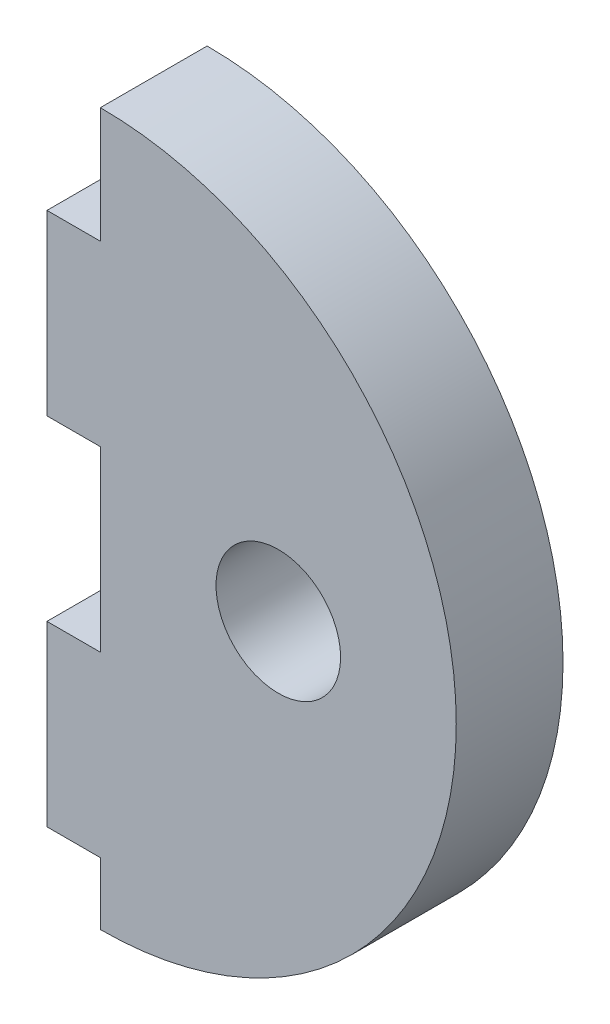
ISO-10303-21;
HEADER;
FILE_DESCRIPTION(('STEP AP214'),'2;1');
FILE_NAME('part.step','',(''),(''),'','','');
FILE_SCHEMA(('AUTOMOTIVE_DESIGN { 1 0 10303 214 1 1 1 1 }'));
ENDSEC;
DATA;
#1=APPLICATION_CONTEXT('core data for automotive mechanical design processes');
#2=APPLICATION_PROTOCOL_DEFINITION('international standard','automotive_design',2000,#1);
#3=PRODUCT_CONTEXT('',#1,'mechanical');
#4=PRODUCT('Part','Part','',(#3));
#5=PRODUCT_RELATED_PRODUCT_CATEGORY('part','',(#4));
#6=PRODUCT_DEFINITION_FORMATION('','',#4);
#7=PRODUCT_DEFINITION_CONTEXT('part definition',#1,'design');
#8=PRODUCT_DEFINITION('design','',#6,#7);
#9=PRODUCT_DEFINITION_SHAPE('','',#8);
#10=(LENGTH_UNIT() NAMED_UNIT(*) SI_UNIT(.MILLI.,.METRE.));
#11=(NAMED_UNIT(*) PLANE_ANGLE_UNIT() SI_UNIT($,.RADIAN.));
#12=(NAMED_UNIT(*) SI_UNIT($,.STERADIAN.) SOLID_ANGLE_UNIT());
#13=UNCERTAINTY_MEASURE_WITH_UNIT(LENGTH_MEASURE(1.E-05),#10,'distance_accuracy_value','');
#14=(GEOMETRIC_REPRESENTATION_CONTEXT(3) GLOBAL_UNCERTAINTY_ASSIGNED_CONTEXT((#13)) GLOBAL_UNIT_ASSIGNED_CONTEXT((#10,
#11,#12)) REPRESENTATION_CONTEXT('',''));
#15=CARTESIAN_POINT('',(0.,0.,0.));
#16=DIRECTION('',(0.,0.,1.));
#17=DIRECTION('',(1.,0.,0.));
#18=AXIS2_PLACEMENT_3D('',#15,#16,#17);
#19=CARTESIAN_POINT('',(3.,16.5,6.));
#20=DIRECTION('',(0.,0.,-1.));
#21=DIRECTION('',(-1.,0.,0.));
#22=AXIS2_PLACEMENT_3D('',#19,#20,#21);
#23=PLANE('',#22);
#24=DIRECTION('',(1.,0.,0.));
#25=VECTOR('',#24,1.);
#26=CARTESIAN_POINT('',(0.,0.,6.));
#27=LINE('',#26,#25);
#28=CARTESIAN_POINT('',(0.,0.,6.));
#29=VERTEX_POINT('',#28);
#30=CARTESIAN_POINT('',(3.,0.,6.));
#31=VERTEX_POINT('',#30);
#32=EDGE_CURVE('E161',#29,#31,#27,.T.);
#33=ORIENTED_EDGE('',*,*,#32,.T.);
#34=DIRECTION('',(0.,-1.,0.));
#35=VECTOR('',#34,1.);
#36=CARTESIAN_POINT('',(3.,0.,6.));
#37=LINE('',#36,#35);
#38=CARTESIAN_POINT('',(3.,-3.5,6.));
#39=VERTEX_POINT('',#38);
#40=EDGE_CURVE('E99',#31,#39,#37,.T.);
#41=ORIENTED_EDGE('',*,*,#40,.T.);
#42=CARTESIAN_POINT('',(3.,16.5,6.));
#43=DIRECTION('',(0.,0.,1.));
#44=DIRECTION('',(-1.,0.,0.));
#45=AXIS2_PLACEMENT_3D('',#42,#43,#44);
#46=CIRCLE('',#45,20.);
#47=CARTESIAN_POINT('',(3.,36.5,6.));
#48=VERTEX_POINT('',#47);
#49=EDGE_CURVE('E182',#39,#48,#46,.T.);
#50=ORIENTED_EDGE('',*,*,#49,.T.);
#51=DIRECTION('',(0.,-1.,0.));
#52=VECTOR('',#51,1.);
#53=CARTESIAN_POINT('',(3.,30.,6.));
#54=LINE('',#53,#52);
#55=CARTESIAN_POINT('',(3.,30.,6.));
#56=VERTEX_POINT('',#55);
#57=EDGE_CURVE('E201',#48,#56,#54,.T.);
#58=ORIENTED_EDGE('',*,*,#57,.T.);
#59=DIRECTION('',(-1.,0.,0.));
#60=VECTOR('',#59,1.);
#61=CARTESIAN_POINT('',(0.,30.,6.));
#62=LINE('',#61,#60);
#63=CARTESIAN_POINT('',(0.,30.,6.));
#64=VERTEX_POINT('',#63);
#65=EDGE_CURVE('E198',#56,#64,#62,.T.);
#66=ORIENTED_EDGE('',*,*,#65,.T.);
#67=DIRECTION('',(0.,-1.,0.));
#68=VECTOR('',#67,1.);
#69=CARTESIAN_POINT('',(0.,20.,6.));
#70=LINE('',#69,#68);
#71=CARTESIAN_POINT('',(0.,20.,6.));
#72=VERTEX_POINT('',#71);
#73=EDGE_CURVE('E200',#64,#72,#70,.T.);
#74=ORIENTED_EDGE('',*,*,#73,.T.);
#75=DIRECTION('',(1.,0.,0.));
#76=VECTOR('',#75,1.);
#77=CARTESIAN_POINT('',(3.,20.,6.));
#78=LINE('',#77,#76);
#79=CARTESIAN_POINT('',(3.,20.,6.));
#80=VERTEX_POINT('',#79);
#81=EDGE_CURVE('E124',#72,#80,#78,.T.);
#82=ORIENTED_EDGE('',*,*,#81,.T.);
#83=DIRECTION('',(0.,-1.,0.));
#84=VECTOR('',#83,1.);
#85=CARTESIAN_POINT('',(3.,10.,6.));
#86=LINE('',#85,#84);
#87=CARTESIAN_POINT('',(3.,10.,6.));
#88=VERTEX_POINT('',#87);
#89=EDGE_CURVE('E118',#80,#88,#86,.T.);
#90=ORIENTED_EDGE('',*,*,#89,.T.);
#91=DIRECTION('',(-1.,0.,0.));
#92=VECTOR('',#91,1.);
#93=CARTESIAN_POINT('',(0.,10.,6.));
#94=LINE('',#93,#92);
#95=CARTESIAN_POINT('',(0.,10.,6.));
#96=VERTEX_POINT('',#95);
#97=EDGE_CURVE('E122',#88,#96,#94,.T.);
#98=ORIENTED_EDGE('',*,*,#97,.T.);
#99=DIRECTION('',(0.,-1.,0.));
#100=VECTOR('',#99,1.);
#101=CARTESIAN_POINT('',(0.,0.,6.));
#102=LINE('',#101,#100);
#103=EDGE_CURVE('E50',#96,#29,#102,.T.);
#104=ORIENTED_EDGE('',*,*,#103,.T.);
#105=EDGE_LOOP('',(#33,#41,#50,#58,#66,#74,#82,#90,#98,#104));
#106=FACE_BOUND('',#105,.T.);
#107=CARTESIAN_POINT('',(13.,16.5,6.));
#108=DIRECTION('',(0.,0.,1.));
#109=DIRECTION('',(1.,0.,0.));
#110=AXIS2_PLACEMENT_3D('',#107,#108,#109);
#111=CIRCLE('',#110,3.5);
#112=CARTESIAN_POINT('',(16.5,16.5,6.));
#113=VERTEX_POINT('',#112);
#114=EDGE_CURVE('E146',#113,#113,#111,.T.);
#115=ORIENTED_EDGE('',*,*,#114,.F.);
#116=EDGE_LOOP('',(#115));
#117=FACE_BOUND('',#116,.T.);
#118=ADVANCED_FACE('F33',(#106,#117),#23,.F.);
#119=CARTESIAN_POINT('',(3.,16.5,0.));
#120=DIRECTION('',(0.,0.,-1.));
#121=DIRECTION('',(-1.,0.,0.));
#122=AXIS2_PLACEMENT_3D('',#119,#120,#121);
#123=PLANE('',#122);
#124=DIRECTION('',(1.,0.,0.));
#125=VECTOR('',#124,1.);
#126=CARTESIAN_POINT('',(0.,0.,0.));
#127=LINE('',#126,#125);
#128=CARTESIAN_POINT('',(0.,0.,0.));
#129=VERTEX_POINT('',#128);
#130=CARTESIAN_POINT('',(3.,0.,0.));
#131=VERTEX_POINT('',#130);
#132=EDGE_CURVE('E142',#129,#131,#127,.T.);
#133=ORIENTED_EDGE('',*,*,#132,.F.);
#134=DIRECTION('',(0.,-1.,0.));
#135=VECTOR('',#134,1.);
#136=CARTESIAN_POINT('',(0.,0.,0.));
#137=LINE('',#136,#135);
#138=CARTESIAN_POINT('',(0.,10.,0.));
#139=VERTEX_POINT('',#138);
#140=EDGE_CURVE('E91',#139,#129,#137,.T.);
#141=ORIENTED_EDGE('',*,*,#140,.F.);
#142=DIRECTION('',(-1.,0.,0.));
#143=VECTOR('',#142,1.);
#144=CARTESIAN_POINT('',(0.,10.,0.));
#145=LINE('',#144,#143);
#146=CARTESIAN_POINT('',(3.,10.,0.));
#147=VERTEX_POINT('',#146);
#148=EDGE_CURVE('E85',#147,#139,#145,.T.);
#149=ORIENTED_EDGE('',*,*,#148,.F.);
#150=DIRECTION('',(0.,-1.,0.));
#151=VECTOR('',#150,1.);
#152=CARTESIAN_POINT('',(3.,10.,0.));
#153=LINE('',#152,#151);
#154=CARTESIAN_POINT('',(3.,20.,0.));
#155=VERTEX_POINT('',#154);
#156=EDGE_CURVE('E132',#155,#147,#153,.T.);
#157=ORIENTED_EDGE('',*,*,#156,.F.);
#158=DIRECTION('',(1.,0.,0.));
#159=VECTOR('',#158,1.);
#160=CARTESIAN_POINT('',(3.,20.,0.));
#161=LINE('',#160,#159);
#162=CARTESIAN_POINT('',(0.,20.,0.));
#163=VERTEX_POINT('',#162);
#164=EDGE_CURVE('E156',#163,#155,#161,.T.);
#165=ORIENTED_EDGE('',*,*,#164,.F.);
#166=DIRECTION('',(0.,-1.,0.));
#167=VECTOR('',#166,1.);
#168=CARTESIAN_POINT('',(0.,20.,0.));
#169=LINE('',#168,#167);
#170=CARTESIAN_POINT('',(0.,30.,0.));
#171=VERTEX_POINT('',#170);
#172=EDGE_CURVE('E154',#171,#163,#169,.T.);
#173=ORIENTED_EDGE('',*,*,#172,.F.);
#174=DIRECTION('',(-1.,0.,0.));
#175=VECTOR('',#174,1.);
#176=CARTESIAN_POINT('',(0.,30.,0.));
#177=LINE('',#176,#175);
#178=CARTESIAN_POINT('',(3.,30.,0.));
#179=VERTEX_POINT('',#178);
#180=EDGE_CURVE('E152',#179,#171,#177,.T.);
#181=ORIENTED_EDGE('',*,*,#180,.F.);
#182=DIRECTION('',(0.,-1.,0.));
#183=VECTOR('',#182,1.);
#184=CARTESIAN_POINT('',(3.,30.,0.));
#185=LINE('',#184,#183);
#186=CARTESIAN_POINT('',(3.,36.5,0.));
#187=VERTEX_POINT('',#186);
#188=EDGE_CURVE('E150',#187,#179,#185,.T.);
#189=ORIENTED_EDGE('',*,*,#188,.F.);
#190=CARTESIAN_POINT('',(3.,16.5,0.));
#191=DIRECTION('',(0.,0.,1.));
#192=DIRECTION('',(-1.,0.,0.));
#193=AXIS2_PLACEMENT_3D('',#190,#191,#192);
#194=CIRCLE('',#193,20.);
#195=CARTESIAN_POINT('',(3.,-3.5,0.));
#196=VERTEX_POINT('',#195);
#197=EDGE_CURVE('E148',#196,#187,#194,.T.);
#198=ORIENTED_EDGE('',*,*,#197,.F.);
#199=DIRECTION('',(0.,-1.,0.));
#200=VECTOR('',#199,1.);
#201=CARTESIAN_POINT('',(3.,0.,0.));
#202=LINE('',#201,#200);
#203=EDGE_CURVE('E145',#131,#196,#202,.T.);
#204=ORIENTED_EDGE('',*,*,#203,.F.);
#205=EDGE_LOOP('',(#133,#141,#149,#157,#165,#173,#181,#189,#198,#204));
#206=FACE_BOUND('',#205,.T.);
#207=CARTESIAN_POINT('',(13.,16.5,0.));
#208=DIRECTION('',(0.,0.,1.));
#209=DIRECTION('',(1.,0.,0.));
#210=AXIS2_PLACEMENT_3D('',#207,#208,#209);
#211=CIRCLE('',#210,3.5);
#212=CARTESIAN_POINT('',(16.5,16.5,0.));
#213=VERTEX_POINT('',#212);
#214=EDGE_CURVE('E209',#213,#213,#211,.T.);
#215=ORIENTED_EDGE('',*,*,#214,.T.);
#216=EDGE_LOOP('',(#215));
#217=FACE_BOUND('',#216,.T.);
#218=ADVANCED_FACE('F186',(#206,#217),#123,.T.);
#219=CARTESIAN_POINT('',(0.,0.,6.));
#220=DIRECTION('',(0.,1.,0.));
#221=DIRECTION('',(0.,0.,1.));
#222=AXIS2_PLACEMENT_3D('',#219,#220,#221);
#223=PLANE('',#222);
#224=ORIENTED_EDGE('',*,*,#132,.T.);
#225=DIRECTION('',(0.,0.,-1.));
#226=VECTOR('',#225,1.);
#227=CARTESIAN_POINT('',(3.,0.,6.));
#228=LINE('',#227,#226);
#229=EDGE_CURVE('E11',#31,#131,#228,.T.);
#230=ORIENTED_EDGE('',*,*,#229,.F.);
#231=ORIENTED_EDGE('',*,*,#32,.F.);
#232=DIRECTION('',(0.,0.,-1.));
#233=VECTOR('',#232,1.);
#234=CARTESIAN_POINT('',(0.,0.,6.));
#235=LINE('',#234,#233);
#236=EDGE_CURVE('E138',#29,#129,#235,.T.);
#237=ORIENTED_EDGE('',*,*,#236,.T.);
#238=EDGE_LOOP('',(#224,#230,#231,#237));
#239=FACE_BOUND('',#238,.T.);
#240=ADVANCED_FACE('F35',(#239),#223,.F.);
#241=CARTESIAN_POINT('',(3.,0.,6.));
#242=DIRECTION('',(1.,0.,0.));
#243=DIRECTION('',(0.,1.,0.));
#244=AXIS2_PLACEMENT_3D('',#241,#242,#243);
#245=PLANE('',#244);
#246=ORIENTED_EDGE('',*,*,#203,.T.);
#247=DIRECTION('',(0.,0.,-1.));
#248=VECTOR('',#247,1.);
#249=CARTESIAN_POINT('',(3.,-3.5,6.));
#250=LINE('',#249,#248);
#251=EDGE_CURVE('E42',#39,#196,#250,.T.);
#252=ORIENTED_EDGE('',*,*,#251,.F.);
#253=ORIENTED_EDGE('',*,*,#40,.F.);
#254=ORIENTED_EDGE('',*,*,#229,.T.);
#255=EDGE_LOOP('',(#246,#252,#253,#254));
#256=FACE_BOUND('',#255,.T.);
#257=ADVANCED_FACE('F245',(#256),#245,.F.);
#258=CARTESIAN_POINT('',(3.,16.5,6.));
#259=DIRECTION('',(0.,0.,-1.));
#260=DIRECTION('',(-1.,0.,0.));
#261=AXIS2_PLACEMENT_3D('',#258,#259,#260);
#262=CYLINDRICAL_SURFACE('',#261,20.);
#263=ORIENTED_EDGE('',*,*,#197,.T.);
#264=DIRECTION('',(0.,0.,-1.));
#265=VECTOR('',#264,1.);
#266=CARTESIAN_POINT('',(3.,36.5,6.));
#267=LINE('',#266,#265);
#268=EDGE_CURVE('E174',#48,#187,#267,.T.);
#269=ORIENTED_EDGE('',*,*,#268,.F.);
#270=ORIENTED_EDGE('',*,*,#49,.F.);
#271=ORIENTED_EDGE('',*,*,#251,.T.);
#272=EDGE_LOOP('',(#263,#269,#270,#271));
#273=FACE_BOUND('',#272,.T.);
#274=ADVANCED_FACE('F180',(#273),#262,.T.);
#275=CARTESIAN_POINT('',(3.,30.,6.));
#276=DIRECTION('',(1.,0.,0.));
#277=DIRECTION('',(0.,1.,0.));
#278=AXIS2_PLACEMENT_3D('',#275,#276,#277);
#279=PLANE('',#278);
#280=ORIENTED_EDGE('',*,*,#188,.T.);
#281=DIRECTION('',(0.,0.,-1.));
#282=VECTOR('',#281,1.);
#283=CARTESIAN_POINT('',(3.,30.,6.));
#284=LINE('',#283,#282);
#285=EDGE_CURVE('E171',#56,#179,#284,.T.);
#286=ORIENTED_EDGE('',*,*,#285,.F.);
#287=ORIENTED_EDGE('',*,*,#57,.F.);
#288=ORIENTED_EDGE('',*,*,#268,.T.);
#289=EDGE_LOOP('',(#280,#286,#287,#288));
#290=FACE_BOUND('',#289,.T.);
#291=ADVANCED_FACE('F192',(#290),#279,.F.);
#292=CARTESIAN_POINT('',(0.,30.,6.));
#293=DIRECTION('',(0.,-1.,0.));
#294=DIRECTION('',(0.,0.,-1.));
#295=AXIS2_PLACEMENT_3D('',#292,#293,#294);
#296=PLANE('',#295);
#297=ORIENTED_EDGE('',*,*,#180,.T.);
#298=DIRECTION('',(0.,0.,-1.));
#299=VECTOR('',#298,1.);
#300=CARTESIAN_POINT('',(0.,30.,6.));
#301=LINE('',#300,#299);
#302=EDGE_CURVE('E168',#64,#171,#301,.T.);
#303=ORIENTED_EDGE('',*,*,#302,.F.);
#304=ORIENTED_EDGE('',*,*,#65,.F.);
#305=ORIENTED_EDGE('',*,*,#285,.T.);
#306=EDGE_LOOP('',(#297,#303,#304,#305));
#307=FACE_BOUND('',#306,.T.);
#308=ADVANCED_FACE('F196',(#307),#296,.F.);
#309=CARTESIAN_POINT('',(0.,20.,6.));
#310=DIRECTION('',(1.,0.,0.));
#311=DIRECTION('',(0.,1.,0.));
#312=AXIS2_PLACEMENT_3D('',#309,#310,#311);
#313=PLANE('',#312);
#314=ORIENTED_EDGE('',*,*,#172,.T.);
#315=DIRECTION('',(0.,0.,-1.));
#316=VECTOR('',#315,1.);
#317=CARTESIAN_POINT('',(0.,20.,6.));
#318=LINE('',#317,#316);
#319=EDGE_CURVE('E165',#72,#163,#318,.T.);
#320=ORIENTED_EDGE('',*,*,#319,.F.);
#321=ORIENTED_EDGE('',*,*,#73,.F.);
#322=ORIENTED_EDGE('',*,*,#302,.T.);
#323=EDGE_LOOP('',(#314,#320,#321,#322));
#324=FACE_BOUND('',#323,.T.);
#325=ADVANCED_FACE('F235',(#324),#313,.F.);
#326=CARTESIAN_POINT('',(3.,20.,6.));
#327=DIRECTION('',(0.,1.,0.));
#328=DIRECTION('',(0.,0.,1.));
#329=AXIS2_PLACEMENT_3D('',#326,#327,#328);
#330=PLANE('',#329);
#331=ORIENTED_EDGE('',*,*,#164,.T.);
#332=DIRECTION('',(0.,0.,-1.));
#333=VECTOR('',#332,1.);
#334=CARTESIAN_POINT('',(3.,20.,6.));
#335=LINE('',#334,#333);
#336=EDGE_CURVE('E133',#80,#155,#335,.T.);
#337=ORIENTED_EDGE('',*,*,#336,.F.);
#338=ORIENTED_EDGE('',*,*,#81,.F.);
#339=ORIENTED_EDGE('',*,*,#319,.T.);
#340=EDGE_LOOP('',(#331,#337,#338,#339));
#341=FACE_BOUND('',#340,.T.);
#342=ADVANCED_FACE('F232',(#341),#330,.F.);
#343=CARTESIAN_POINT('',(3.,10.,6.));
#344=DIRECTION('',(1.,0.,0.));
#345=DIRECTION('',(0.,1.,0.));
#346=AXIS2_PLACEMENT_3D('',#343,#344,#345);
#347=PLANE('',#346);
#348=ORIENTED_EDGE('',*,*,#156,.T.);
#349=DIRECTION('',(0.,0.,-1.));
#350=VECTOR('',#349,1.);
#351=CARTESIAN_POINT('',(3.,10.,6.));
#352=LINE('',#351,#350);
#353=EDGE_CURVE('E129',#88,#147,#352,.T.);
#354=ORIENTED_EDGE('',*,*,#353,.F.);
#355=ORIENTED_EDGE('',*,*,#89,.F.);
#356=ORIENTED_EDGE('',*,*,#336,.T.);
#357=EDGE_LOOP('',(#348,#354,#355,#356));
#358=FACE_BOUND('',#357,.T.);
#359=ADVANCED_FACE('F130',(#358),#347,.F.);
#360=CARTESIAN_POINT('',(0.,10.,6.));
#361=DIRECTION('',(0.,-1.,0.));
#362=DIRECTION('',(0.,0.,-1.));
#363=AXIS2_PLACEMENT_3D('',#360,#361,#362);
#364=PLANE('',#363);
#365=ORIENTED_EDGE('',*,*,#148,.T.);
#366=DIRECTION('',(0.,0.,-1.));
#367=VECTOR('',#366,1.);
#368=CARTESIAN_POINT('',(0.,10.,6.));
#369=LINE('',#368,#367);
#370=EDGE_CURVE('E134',#96,#139,#369,.T.);
#371=ORIENTED_EDGE('',*,*,#370,.F.);
#372=ORIENTED_EDGE('',*,*,#97,.F.);
#373=ORIENTED_EDGE('',*,*,#353,.T.);
#374=EDGE_LOOP('',(#365,#371,#372,#373));
#375=FACE_BOUND('',#374,.T.);
#376=ADVANCED_FACE('F136',(#375),#364,.F.);
#377=CARTESIAN_POINT('',(0.,0.,6.));
#378=DIRECTION('',(1.,0.,0.));
#379=DIRECTION('',(0.,0.,-1.));
#380=AXIS2_PLACEMENT_3D('',#377,#378,#379);
#381=PLANE('',#380);
#382=ORIENTED_EDGE('',*,*,#140,.T.);
#383=ORIENTED_EDGE('',*,*,#236,.F.);
#384=ORIENTED_EDGE('',*,*,#103,.F.);
#385=ORIENTED_EDGE('',*,*,#370,.T.);
#386=EDGE_LOOP('',(#382,#383,#384,#385));
#387=FACE_BOUND('',#386,.T.);
#388=ADVANCED_FACE('F225',(#387),#381,.F.);
#389=CARTESIAN_POINT('',(13.,16.5,6.));
#390=DIRECTION('',(0.,0.,-1.));
#391=DIRECTION('',(-1.,0.,0.));
#392=AXIS2_PLACEMENT_3D('',#389,#390,#391);
#393=CYLINDRICAL_SURFACE('',#392,3.5);
#394=ORIENTED_EDGE('',*,*,#114,.T.);
#395=EDGE_LOOP('',(#394));
#396=FACE_BOUND('',#395,.T.);
#397=ORIENTED_EDGE('',*,*,#214,.F.);
#398=EDGE_LOOP('',(#397));
#399=FACE_BOUND('',#398,.T.);
#400=ADVANCED_FACE('F215',(#396,#399),#393,.F.);
#401=CLOSED_SHELL('',(#118,#218,#240,#257,#274,#291,#308,#325,#342,#359,#376,#388,#400));
#402=MANIFOLD_SOLID_BREP('B2',#401);
#403=ADVANCED_BREP_SHAPE_REPRESENTATION('',(#18,#402),#14);
#404=SHAPE_DEFINITION_REPRESENTATION(#9,#403);
ENDSEC;
END-ISO-10303-21;
